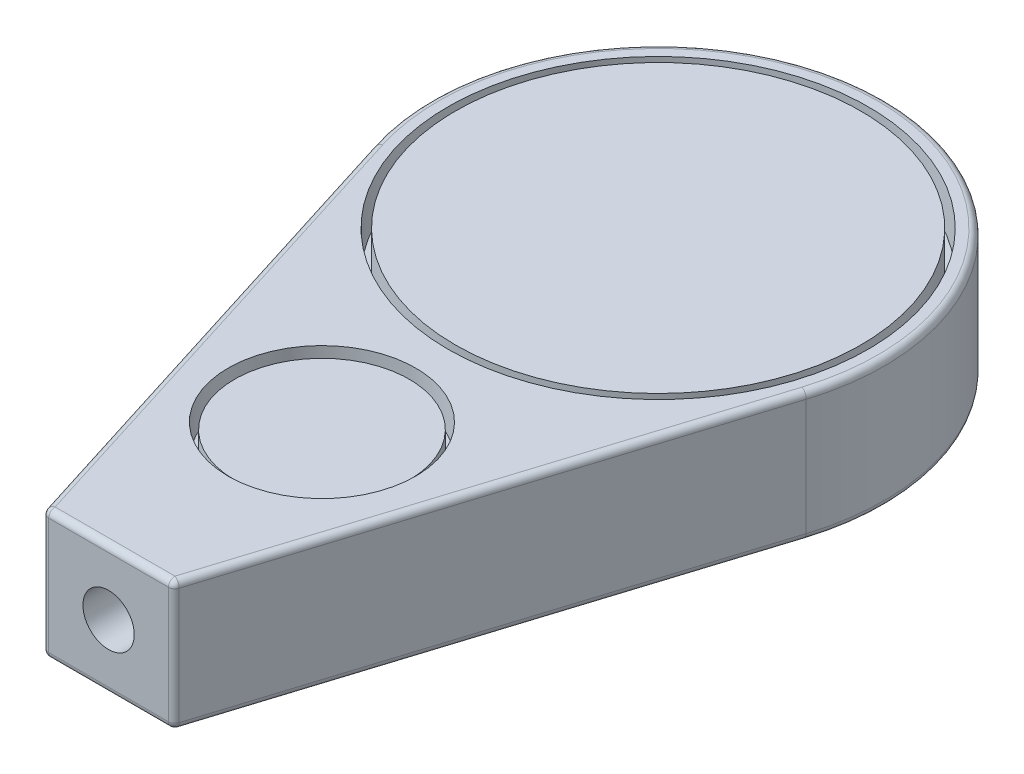
ISO-10303-21;
HEADER;
FILE_DESCRIPTION(('STEP AP214'),'2;1');
FILE_NAME('part.step','',(''),(''),'','','');
FILE_SCHEMA(('AUTOMOTIVE_DESIGN { 1 0 10303 214 1 1 1 1 }'));
ENDSEC;
DATA;
#1=APPLICATION_CONTEXT('core data for automotive mechanical design processes');
#2=APPLICATION_PROTOCOL_DEFINITION('international standard','automotive_design',2000,#1);
#3=PRODUCT_CONTEXT('',#1,'mechanical');
#4=PRODUCT('Part','Part','',(#3));
#5=PRODUCT_RELATED_PRODUCT_CATEGORY('part','',(#4));
#6=PRODUCT_DEFINITION_FORMATION('','',#4);
#7=PRODUCT_DEFINITION_CONTEXT('part definition',#1,'design');
#8=PRODUCT_DEFINITION('design','',#6,#7);
#9=PRODUCT_DEFINITION_SHAPE('','',#8);
#10=(LENGTH_UNIT() NAMED_UNIT(*) SI_UNIT(.MILLI.,.METRE.));
#11=(NAMED_UNIT(*) PLANE_ANGLE_UNIT() SI_UNIT($,.RADIAN.));
#12=(NAMED_UNIT(*) SI_UNIT($,.STERADIAN.) SOLID_ANGLE_UNIT());
#13=UNCERTAINTY_MEASURE_WITH_UNIT(LENGTH_MEASURE(1.E-05),#10,'distance_accuracy_value','');
#14=(GEOMETRIC_REPRESENTATION_CONTEXT(3) GLOBAL_UNCERTAINTY_ASSIGNED_CONTEXT((#13)) GLOBAL_UNIT_ASSIGNED_CONTEXT((#10,
#11,#12)) REPRESENTATION_CONTEXT('',''));
#15=CARTESIAN_POINT('',(0.,0.,0.));
#16=DIRECTION('',(0.,0.,1.));
#17=DIRECTION('',(1.,0.,0.));
#18=AXIS2_PLACEMENT_3D('',#15,#16,#17);
#19=CARTESIAN_POINT('',(0.,20.,0.));
#20=DIRECTION('',(0.,-1.,0.));
#21=DIRECTION('',(0.,0.,-1.));
#22=AXIS2_PLACEMENT_3D('',#19,#20,#21);
#23=CYLINDRICAL_SURFACE('',#22,35.);
#24=DIRECTION('',(0.,-1.,0.));
#25=VECTOR('',#24,1.);
#26=CARTESIAN_POINT('',(33.3931642127267,120.065845984876,10.4831571514439));
#27=LINE('',#26,#25);
#28=CARTESIAN_POINT('',(33.3931642127267,19.,10.4831571514439));
#29=VERTEX_POINT('',#28);
#30=CARTESIAN_POINT('',(33.3931642127267,1.,10.4831571514439));
#31=VERTEX_POINT('',#30);
#32=EDGE_CURVE('E150',#29,#31,#27,.T.);
#33=ORIENTED_EDGE('',*,*,#32,.T.);
#34=CARTESIAN_POINT('',(0.,1.,0.));
#35=DIRECTION('',(0.,1.,0.));
#36=DIRECTION('',(0.,0.,1.));
#37=AXIS2_PLACEMENT_3D('',#34,#35,#36);
#38=CIRCLE('',#37,35.);
#39=CARTESIAN_POINT('',(-33.3931642127267,1.,10.4831571514439));
#40=VERTEX_POINT('',#39);
#41=EDGE_CURVE('E187',#31,#40,#38,.T.);
#42=ORIENTED_EDGE('',*,*,#41,.T.);
#43=DIRECTION('',(0.,-1.,0.));
#44=VECTOR('',#43,1.);
#45=CARTESIAN_POINT('',(-33.3931642127267,120.065845984876,10.4831571514439));
#46=LINE('',#45,#44);
#47=CARTESIAN_POINT('',(-33.3931642127267,19.,10.4831571514439));
#48=VERTEX_POINT('',#47);
#49=EDGE_CURVE('E153',#48,#40,#46,.T.);
#50=ORIENTED_EDGE('',*,*,#49,.F.);
#51=CARTESIAN_POINT('',(0.,19.,0.));
#52=DIRECTION('',(0.,1.,0.));
#53=DIRECTION('',(0.,0.,1.));
#54=AXIS2_PLACEMENT_3D('',#51,#52,#53);
#55=CIRCLE('',#54,35.);
#56=EDGE_CURVE('E185',#48,#29,#55,.F.);
#57=ORIENTED_EDGE('',*,*,#56,.T.);
#58=EDGE_LOOP('',(#33,#42,#50,#57));
#59=FACE_BOUND('',#58,.T.);
#60=ADVANCED_FACE('F49',(#59),#23,.T.);
#61=CARTESIAN_POINT('',(0.,20.,0.));
#62=DIRECTION('',(0.,1.,0.));
#63=DIRECTION('',(0.,0.,1.));
#64=AXIS2_PLACEMENT_3D('',#61,#62,#63);
#65=PLANE('',#64);
#66=DIRECTION('',(1.,0.,0.));
#67=VECTOR('',#66,1.);
#68=CARTESIAN_POINT('',(10.,20.,84.));
#69=LINE('',#68,#67);
#70=CARTESIAN_POINT('',(-9.26581252700777,20.,84.));
#71=VERTEX_POINT('',#70);
#72=CARTESIAN_POINT('',(9.26581252700777,20.,84.));
#73=VERTEX_POINT('',#72);
#74=EDGE_CURVE('E191',#71,#73,#69,.T.);
#75=ORIENTED_EDGE('',*,*,#74,.T.);
#76=DIRECTION('',(0.299518775755541,0.,-0.954090406077905));
#77=VECTOR('',#76,1.);
#78=CARTESIAN_POINT('',(32.4390738066488,20.,10.1836383756884));
#79=LINE('',#78,#77);
#80=CARTESIAN_POINT('',(32.4390738066488,20.,10.1836383756884));
#81=VERTEX_POINT('',#80);
#82=EDGE_CURVE('E195',#73,#81,#79,.T.);
#83=ORIENTED_EDGE('',*,*,#82,.T.);
#84=CARTESIAN_POINT('',(0.,20.,0.));
#85=DIRECTION('',(0.,1.,0.));
#86=DIRECTION('',(0.,0.,1.));
#87=AXIS2_PLACEMENT_3D('',#84,#85,#86);
#88=CIRCLE('',#87,34.);
#89=CARTESIAN_POINT('',(-32.4390738066488,20.,10.1836383756884));
#90=VERTEX_POINT('',#89);
#91=EDGE_CURVE('E193',#81,#90,#88,.T.);
#92=ORIENTED_EDGE('',*,*,#91,.T.);
#93=DIRECTION('',(0.299518775755541,0.,0.954090406077905));
#94=VECTOR('',#93,1.);
#95=CARTESIAN_POINT('',(-9.04590959392208,20.,84.7004812242445));
#96=LINE('',#95,#94);
#97=EDGE_CURVE('E189',#90,#71,#96,.T.);
#98=ORIENTED_EDGE('',*,*,#97,.T.);
#99=EDGE_LOOP('',(#75,#83,#92,#98));
#100=FACE_BOUND('',#99,.T.);
#101=CARTESIAN_POINT('',(0.,20.,52.));
#102=DIRECTION('',(0.,1.,0.));
#103=DIRECTION('',(0.,0.,1.));
#104=AXIS2_PLACEMENT_3D('',#101,#102,#103);
#105=CIRCLE('',#104,14.5);
#106=CARTESIAN_POINT('',(0.,20.,66.5));
#107=VERTEX_POINT('',#106);
#108=EDGE_CURVE('E145',#107,#107,#105,.T.);
#109=ORIENTED_EDGE('',*,*,#108,.F.);
#110=EDGE_LOOP('',(#109));
#111=FACE_BOUND('',#110,.T.);
#112=CARTESIAN_POINT('',(0.,20.,0.));
#113=DIRECTION('',(0.,1.,0.));
#114=DIRECTION('',(0.,0.,1.));
#115=AXIS2_PLACEMENT_3D('',#112,#113,#114);
#116=CIRCLE('',#115,32.5);
#117=CARTESIAN_POINT('',(0.,20.,32.5));
#118=VERTEX_POINT('',#117);
#119=EDGE_CURVE('E163',#118,#118,#116,.T.);
#120=ORIENTED_EDGE('',*,*,#119,.F.);
#121=EDGE_LOOP('',(#120));
#122=FACE_BOUND('',#121,.T.);
#123=ADVANCED_FACE('F263',(#100,#111,#122),#65,.T.);
#124=CARTESIAN_POINT('',(0.,0.,0.));
#125=DIRECTION('',(0.,1.,0.));
#126=DIRECTION('',(0.,0.,1.));
#127=AXIS2_PLACEMENT_3D('',#124,#125,#126);
#128=PLANE('',#127);
#129=CARTESIAN_POINT('',(0.,0.,0.));
#130=DIRECTION('',(0.,1.,0.));
#131=DIRECTION('',(0.,0.,1.));
#132=AXIS2_PLACEMENT_3D('',#129,#130,#131);
#133=CIRCLE('',#132,34.);
#134=CARTESIAN_POINT('',(-32.4390738066488,0.,10.1836383756884));
#135=VERTEX_POINT('',#134);
#136=CARTESIAN_POINT('',(32.4390738066488,0.,10.1836383756884));
#137=VERTEX_POINT('',#136);
#138=EDGE_CURVE('E180',#135,#137,#133,.F.);
#139=ORIENTED_EDGE('',*,*,#138,.T.);
#140=DIRECTION('',(0.299518775755541,0.,-0.954090406077905));
#141=VECTOR('',#140,1.);
#142=CARTESIAN_POINT('',(32.4390738066488,0.,10.1836383756884));
#143=LINE('',#142,#141);
#144=CARTESIAN_POINT('',(9.26581252700778,0.,84.));
#145=VERTEX_POINT('',#144);
#146=EDGE_CURVE('E182',#137,#145,#143,.F.);
#147=ORIENTED_EDGE('',*,*,#146,.T.);
#148=DIRECTION('',(1.,0.,0.));
#149=VECTOR('',#148,1.);
#150=CARTESIAN_POINT('',(0.,0.,84.));
#151=LINE('',#150,#149);
#152=CARTESIAN_POINT('',(-9.26581252700777,0.,84.));
#153=VERTEX_POINT('',#152);
#154=EDGE_CURVE('E178',#145,#153,#151,.F.);
#155=ORIENTED_EDGE('',*,*,#154,.T.);
#156=DIRECTION('',(0.299518775755541,0.,0.954090406077905));
#157=VECTOR('',#156,1.);
#158=CARTESIAN_POINT('',(-32.4390738066488,0.,10.1836383756884));
#159=LINE('',#158,#157);
#160=EDGE_CURVE('E176',#153,#135,#159,.F.);
#161=ORIENTED_EDGE('',*,*,#160,.T.);
#162=EDGE_LOOP('',(#139,#147,#155,#161));
#163=FACE_BOUND('',#162,.T.);
#164=ADVANCED_FACE('F303',(#163),#128,.F.);
#165=CARTESIAN_POINT('',(0.,13.5,0.));
#166=DIRECTION('',(0.,1.,0.));
#167=DIRECTION('',(0.,0.,1.));
#168=AXIS2_PLACEMENT_3D('',#165,#166,#167);
#169=CYLINDRICAL_SURFACE('',#168,32.5);
#170=CARTESIAN_POINT('',(0.,13.5,0.));
#171=DIRECTION('',(0.,1.,0.));
#172=DIRECTION('',(0.,0.,1.));
#173=AXIS2_PLACEMENT_3D('',#170,#171,#172);
#174=CIRCLE('',#173,32.5);
#175=CARTESIAN_POINT('',(0.,13.5,32.5));
#176=VERTEX_POINT('',#175);
#177=EDGE_CURVE('E164',#176,#176,#174,.T.);
#178=CARTESIAN_POINT('',(0.,13.5,32.5));
#179=CARTESIAN_POINT('',(0.,13.5677083333333,32.5));
#180=CARTESIAN_POINT('',(0.,13.6354166666667,32.5));
#181=CARTESIAN_POINT('',(0.,13.7708333333333,32.5));
#182=CARTESIAN_POINT('',(0.,13.8385416666667,32.5));
#183=CARTESIAN_POINT('',(0.,13.9739583333333,32.5));
#184=CARTESIAN_POINT('',(0.,14.0416666666667,32.5));
#185=CARTESIAN_POINT('',(0.,14.1770833333333,32.5));
#186=CARTESIAN_POINT('',(0.,14.2447916666667,32.5));
#187=CARTESIAN_POINT('',(0.,14.3802083333333,32.5));
#188=CARTESIAN_POINT('',(0.,14.4479166666667,32.5));
#189=CARTESIAN_POINT('',(0.,14.5833333333333,32.5));
#190=CARTESIAN_POINT('',(0.,14.6510416666667,32.5));
#191=CARTESIAN_POINT('',(0.,14.7864583333333,32.5));
#192=CARTESIAN_POINT('',(0.,14.8541666666667,32.5));
#193=CARTESIAN_POINT('',(0.,14.9895833333333,32.5));
#194=CARTESIAN_POINT('',(0.,15.0572916666667,32.5));
#195=CARTESIAN_POINT('',(0.,15.1927083333333,32.5));
#196=CARTESIAN_POINT('',(0.,15.2604166666667,32.5));
#197=CARTESIAN_POINT('',(0.,15.3958333333333,32.5));
#198=CARTESIAN_POINT('',(0.,15.4635416666667,32.5));
#199=CARTESIAN_POINT('',(0.,15.5989583333333,32.5));
#200=CARTESIAN_POINT('',(0.,15.6666666666667,32.5));
#201=CARTESIAN_POINT('',(0.,15.8020833333333,32.5));
#202=CARTESIAN_POINT('',(0.,15.8697916666667,32.5));
#203=CARTESIAN_POINT('',(0.,16.0052083333333,32.5));
#204=CARTESIAN_POINT('',(0.,16.0729166666667,32.5));
#205=CARTESIAN_POINT('',(0.,16.2083333333333,32.5));
#206=CARTESIAN_POINT('',(0.,16.2760416666667,32.5));
#207=CARTESIAN_POINT('',(0.,16.4114583333333,32.5));
#208=CARTESIAN_POINT('',(0.,16.4791666666667,32.5));
#209=CARTESIAN_POINT('',(0.,16.6145833333333,32.5));
#210=CARTESIAN_POINT('',(0.,16.6822916666667,32.5));
#211=CARTESIAN_POINT('',(0.,16.8177083333333,32.5));
#212=CARTESIAN_POINT('',(0.,16.8854166666667,32.5));
#213=CARTESIAN_POINT('',(0.,17.0208333333333,32.5));
#214=CARTESIAN_POINT('',(0.,17.0885416666667,32.5));
#215=CARTESIAN_POINT('',(0.,17.2239583333333,32.5));
#216=CARTESIAN_POINT('',(0.,17.2916666666667,32.5));
#217=CARTESIAN_POINT('',(0.,17.4270833333333,32.5));
#218=CARTESIAN_POINT('',(0.,17.4947916666667,32.5));
#219=CARTESIAN_POINT('',(0.,17.6302083333333,32.5));
#220=CARTESIAN_POINT('',(0.,17.6979166666667,32.5));
#221=CARTESIAN_POINT('',(0.,17.8333333333333,32.5));
#222=CARTESIAN_POINT('',(0.,17.9010416666667,32.5));
#223=CARTESIAN_POINT('',(0.,18.0364583333333,32.5));
#224=CARTESIAN_POINT('',(0.,18.1041666666667,32.5));
#225=CARTESIAN_POINT('',(0.,18.2395833333333,32.5));
#226=CARTESIAN_POINT('',(0.,18.3072916666667,32.5));
#227=CARTESIAN_POINT('',(0.,18.4427083333333,32.5));
#228=CARTESIAN_POINT('',(0.,18.5104166666667,32.5));
#229=CARTESIAN_POINT('',(0.,18.6458333333333,32.5));
#230=CARTESIAN_POINT('',(0.,18.7135416666667,32.5));
#231=CARTESIAN_POINT('',(0.,18.8489583333333,32.5));
#232=CARTESIAN_POINT('',(0.,18.9166666666667,32.5));
#233=CARTESIAN_POINT('',(0.,19.0520833333333,32.5));
#234=CARTESIAN_POINT('',(0.,19.1197916666667,32.5));
#235=CARTESIAN_POINT('',(0.,19.2552083333333,32.5));
#236=CARTESIAN_POINT('',(0.,19.3229166666667,32.5));
#237=CARTESIAN_POINT('',(0.,19.4583333333333,32.5));
#238=CARTESIAN_POINT('',(0.,19.5260416666667,32.5));
#239=CARTESIAN_POINT('',(0.,19.6614583333333,32.5));
#240=CARTESIAN_POINT('',(0.,19.7291666666667,32.5));
#241=CARTESIAN_POINT('',(0.,19.8645833333333,32.5));
#242=CARTESIAN_POINT('',(0.,19.9322916666667,32.5));
#243=CARTESIAN_POINT('',(0.,20.,32.5));
#244=B_SPLINE_CURVE_WITH_KNOTS('',3,(#178,#179,#180,#181,#182,#183,#184,#185,#186,#187,#188,
#189,#190,#191,#192,#193,#194,#195,#196,#197,#198,#199,#200,#201,#202,#203,#204,#205,#206,#207,
#208,#209,#210,#211,#212,#213,#214,#215,#216,#217,#218,#219,#220,#221,#222,#223,#224,#225,#226,
#227,#228,#229,#230,#231,#232,#233,#234,#235,#236,#237,#238,#239,#240,#241,#242,#243),
.UNSPECIFIED.,.F.,.F.,(4,2,2,2,2,2,2,2,2,2,2,2,2,2,2,2,2,2,2,2,2,2,2,2,2,2,2,2,2,2,2,2,4),(0.,
0.203125,0.40625,0.609375000000001,0.812500000000001,1.015625,1.21875,1.421875,1.625,1.828125,
2.03125,2.234375,2.4375,2.640625,2.84375,3.046875,3.25,3.453125,3.65625,3.859375,4.0625,
4.265625,4.46875,4.671875,4.875,5.078125,5.28125,5.484375,5.6875,5.890625,6.09375,6.296875,6.5),.UNSPECIFIED.);
#245=EDGE_CURVE('BSEAM516',#176,#118,#244,.T.);
#246=ORIENTED_EDGE('',*,*,#177,.F.);
#247=ORIENTED_EDGE('',*,*,#119,.T.);
#248=ORIENTED_EDGE('',*,*,#245,.T.);
#249=ORIENTED_EDGE('',*,*,#245,.F.);
#250=EDGE_LOOP('',(#246,#248,#247,#249));
#251=FACE_BOUND('',#250,.T.);
#252=ADVANCED_FACE('F516',(#251),#169,.F.);
#253=CARTESIAN_POINT('',(0.,13.5,0.));
#254=DIRECTION('',(0.,1.,0.));
#255=DIRECTION('',(0.,0.,1.));
#256=AXIS2_PLACEMENT_3D('',#253,#254,#255);
#257=PLANE('',#256);
#258=CARTESIAN_POINT('',(0.,13.5,0.));
#259=DIRECTION('',(0.,1.,0.));
#260=DIRECTION('',(0.,0.,1.));
#261=AXIS2_PLACEMENT_3D('',#258,#259,#260);
#262=CIRCLE('',#261,31.35);
#263=CARTESIAN_POINT('',(0.,13.5,31.35));
#264=VERTEX_POINT('',#263);
#265=EDGE_CURVE('E155',#264,#264,#262,.T.);
#266=ORIENTED_EDGE('',*,*,#265,.F.);
#267=EDGE_LOOP('',(#266));
#268=FACE_BOUND('',#267,.T.);
#269=ORIENTED_EDGE('',*,*,#177,.T.);
#270=EDGE_LOOP('',(#269));
#271=FACE_BOUND('',#270,.T.);
#272=ADVANCED_FACE('F546',(#268,#271),#257,.T.);
#273=CARTESIAN_POINT('',(0.,108.671190360793,0.));
#274=DIRECTION('',(0.,-1.,0.));
#275=DIRECTION('',(0.,0.,-1.));
#276=AXIS2_PLACEMENT_3D('',#273,#274,#275);
#277=CYLINDRICAL_SURFACE('',#276,31.35);
#278=ORIENTED_EDGE('',*,*,#265,.T.);
#279=EDGE_LOOP('',(#278));
#280=FACE_BOUND('',#279,.T.);
#281=CARTESIAN_POINT('',(0.,20.,0.));
#282=DIRECTION('',(0.,1.,0.));
#283=DIRECTION('',(0.,0.,1.));
#284=AXIS2_PLACEMENT_3D('',#281,#282,#283);
#285=CIRCLE('',#284,31.35);
#286=CARTESIAN_POINT('',(0.,20.,31.35));
#287=VERTEX_POINT('',#286);
#288=EDGE_CURVE('E160',#287,#287,#285,.T.);
#289=ORIENTED_EDGE('',*,*,#288,.F.);
#290=EDGE_LOOP('',(#289));
#291=FACE_BOUND('',#290,.T.);
#292=ADVANCED_FACE('F537',(#280,#291),#277,.T.);
#293=CARTESIAN_POINT('',(0.,20.,0.));
#294=DIRECTION('',(0.,1.,0.));
#295=DIRECTION('',(0.,0.,1.));
#296=AXIS2_PLACEMENT_3D('',#293,#294,#295);
#297=PLANE('',#296);
#298=ORIENTED_EDGE('',*,*,#288,.T.);
#299=EDGE_LOOP('',(#298));
#300=FACE_BOUND('',#299,.T.);
#301=ADVANCED_FACE('F507',(#300),#297,.T.);
#302=CARTESIAN_POINT('',(-33.3931642127267,120.065845984876,10.4831571514439));
#303=DIRECTION('',(0.954090406077905,0.,-0.299518775755541));
#304=DIRECTION('',(-0.299518775755541,0.,-0.954090406077905));
#305=AXIS2_PLACEMENT_3D('',#302,#303,#304);
#306=PLANE('',#305);
#307=ORIENTED_EDGE('',*,*,#49,.T.);
#308=DIRECTION('',(0.299518775755541,0.,0.954090406077905));
#309=VECTOR('',#308,1.);
#310=CARTESIAN_POINT('',(-33.3931642127267,1.,10.4831571514439));
#311=LINE('',#310,#309);
#312=CARTESIAN_POINT('',(-10.2199029330857,1.,84.2995187757555));
#313=VERTEX_POINT('',#312);
#314=EDGE_CURVE('E13',#40,#313,#311,.T.);
#315=ORIENTED_EDGE('',*,*,#314,.T.);
#316=DIRECTION('',(0.,-1.,0.));
#317=VECTOR('',#316,1.);
#318=CARTESIAN_POINT('',(-10.2199029330857,120.065845984876,84.2995187757556));
#319=LINE('',#318,#317);
#320=CARTESIAN_POINT('',(-10.2199029330857,19.,84.2995187757555));
#321=VERTEX_POINT('',#320);
#322=EDGE_CURVE('E58',#313,#321,#319,.F.);
#323=ORIENTED_EDGE('',*,*,#322,.T.);
#324=DIRECTION('',(0.299518775755541,0.,0.954090406077905));
#325=VECTOR('',#324,1.);
#326=CARTESIAN_POINT('',(-33.3931642127267,19.,10.4831571514439));
#327=LINE('',#326,#325);
#328=EDGE_CURVE('E207',#321,#48,#327,.F.);
#329=ORIENTED_EDGE('',*,*,#328,.T.);
#330=EDGE_LOOP('',(#307,#315,#323,#329));
#331=FACE_BOUND('',#330,.T.);
#332=ADVANCED_FACE('F291',(#331),#306,.F.);
#333=CARTESIAN_POINT('',(0.,120.065845984876,85.));
#334=DIRECTION('',(0.,0.,-1.));
#335=DIRECTION('',(-1.,0.,0.));
#336=AXIS2_PLACEMENT_3D('',#333,#334,#335);
#337=PLANE('',#336);
#338=DIRECTION('',(1.,0.,0.));
#339=VECTOR('',#338,1.);
#340=CARTESIAN_POINT('',(0.,1.,85.));
#341=LINE('',#340,#339);
#342=CARTESIAN_POINT('',(-9.26581252700778,1.,85.));
#343=VERTEX_POINT('',#342);
#344=CARTESIAN_POINT('',(9.26581252700778,1.,85.));
#345=VERTEX_POINT('',#344);
#346=EDGE_CURVE('E202',#343,#345,#341,.T.);
#347=ORIENTED_EDGE('',*,*,#346,.T.);
#348=DIRECTION('',(0.,-1.,0.));
#349=VECTOR('',#348,1.);
#350=CARTESIAN_POINT('',(9.26581252700778,120.065845984876,85.));
#351=LINE('',#350,#349);
#352=CARTESIAN_POINT('',(9.26581252700778,19.,85.));
#353=VERTEX_POINT('',#352);
#354=EDGE_CURVE('E204',#345,#353,#351,.F.);
#355=ORIENTED_EDGE('',*,*,#354,.T.);
#356=DIRECTION('',(1.,0.,0.));
#357=VECTOR('',#356,1.);
#358=CARTESIAN_POINT('',(-9.99999999999999,19.,85.));
#359=LINE('',#358,#357);
#360=CARTESIAN_POINT('',(-9.26581252700778,19.,85.));
#361=VERTEX_POINT('',#360);
#362=EDGE_CURVE('E198',#353,#361,#359,.F.);
#363=ORIENTED_EDGE('',*,*,#362,.T.);
#364=DIRECTION('',(0.,-1.,0.));
#365=VECTOR('',#364,1.);
#366=CARTESIAN_POINT('',(-9.26581252700778,120.065845984876,85.));
#367=LINE('',#366,#365);
#368=EDGE_CURVE('E200',#361,#343,#367,.T.);
#369=ORIENTED_EDGE('',*,*,#368,.T.);
#370=EDGE_LOOP('',(#347,#355,#363,#369));
#371=FACE_BOUND('',#370,.T.);
#372=CARTESIAN_POINT('',(0.,10.,85.));
#373=DIRECTION('',(0.,0.,1.));
#374=DIRECTION('',(1.,0.,0.));
#375=AXIS2_PLACEMENT_3D('',#372,#373,#374);
#376=CIRCLE('',#375,3.96874999999999);
#377=CARTESIAN_POINT('',(3.96874999999999,10.,85.));
#378=VERTEX_POINT('',#377);
#379=EDGE_CURVE('E136',#378,#378,#376,.T.);
#380=ORIENTED_EDGE('',*,*,#379,.F.);
#381=EDGE_LOOP('',(#380));
#382=FACE_BOUND('',#381,.T.);
#383=ADVANCED_FACE('F491',(#371,#382),#337,.F.);
#384=CARTESIAN_POINT('',(33.3931642127267,120.065845984876,10.4831571514439));
#385=DIRECTION('',(-0.954090406077905,0.,-0.299518775755541));
#386=DIRECTION('',(-0.299518775755541,0.,0.954090406077905));
#387=AXIS2_PLACEMENT_3D('',#384,#385,#386);
#388=PLANE('',#387);
#389=DIRECTION('',(0.,-1.,0.));
#390=VECTOR('',#389,1.);
#391=CARTESIAN_POINT('',(10.2199029330857,120.065845984876,84.2995187757556));
#392=LINE('',#391,#390);
#393=CARTESIAN_POINT('',(10.2199029330857,19.,84.2995187757555));
#394=VERTEX_POINT('',#393);
#395=CARTESIAN_POINT('',(10.2199029330857,1.,84.2995187757555));
#396=VERTEX_POINT('',#395);
#397=EDGE_CURVE('E167',#394,#396,#392,.T.);
#398=ORIENTED_EDGE('',*,*,#397,.T.);
#399=DIRECTION('',(0.299518775755541,0.,-0.954090406077905));
#400=VECTOR('',#399,1.);
#401=CARTESIAN_POINT('',(33.3931642127267,1.,10.4831571514439));
#402=LINE('',#401,#400);
#403=EDGE_CURVE('E173',#396,#31,#402,.T.);
#404=ORIENTED_EDGE('',*,*,#403,.T.);
#405=ORIENTED_EDGE('',*,*,#32,.F.);
#406=DIRECTION('',(0.299518775755541,0.,-0.954090406077905));
#407=VECTOR('',#406,1.);
#408=CARTESIAN_POINT('',(9.99999999999999,19.,85.));
#409=LINE('',#408,#407);
#410=EDGE_CURVE('E171',#29,#394,#409,.F.);
#411=ORIENTED_EDGE('',*,*,#410,.T.);
#412=EDGE_LOOP('',(#398,#404,#405,#411));
#413=FACE_BOUND('',#412,.T.);
#414=ADVANCED_FACE('F285',(#413),#388,.F.);
#415=CARTESIAN_POINT('',(0.,15.,52.));
#416=DIRECTION('',(0.,1.,0.));
#417=DIRECTION('',(0.,0.,1.));
#418=AXIS2_PLACEMENT_3D('',#415,#416,#417);
#419=CYLINDRICAL_SURFACE('',#418,14.5);
#420=CARTESIAN_POINT('',(0.,15.,52.));
#421=DIRECTION('',(0.,1.,0.));
#422=DIRECTION('',(0.,0.,1.));
#423=AXIS2_PLACEMENT_3D('',#420,#421,#422);
#424=CIRCLE('',#423,14.5);
#425=CARTESIAN_POINT('',(0.,15.,66.5));
#426=VERTEX_POINT('',#425);
#427=EDGE_CURVE('E147',#426,#426,#424,.T.);
#428=ORIENTED_EDGE('',*,*,#427,.F.);
#429=EDGE_LOOP('',(#428));
#430=FACE_BOUND('',#429,.T.);
#431=ORIENTED_EDGE('',*,*,#108,.T.);
#432=EDGE_LOOP('',(#431));
#433=FACE_BOUND('',#432,.T.);
#434=ADVANCED_FACE('F474',(#430,#433),#419,.F.);
#435=CARTESIAN_POINT('',(0.,15.,52.));
#436=DIRECTION('',(0.,1.,0.));
#437=DIRECTION('',(0.,0.,1.));
#438=AXIS2_PLACEMENT_3D('',#435,#436,#437);
#439=PLANE('',#438);
#440=CARTESIAN_POINT('',(0.,15.,52.));
#441=DIRECTION('',(0.,1.,0.));
#442=DIRECTION('',(0.,0.,1.));
#443=AXIS2_PLACEMENT_3D('',#440,#441,#442);
#444=CIRCLE('',#443,13.5);
#445=CARTESIAN_POINT('',(0.,15.,65.5));
#446=VERTEX_POINT('',#445);
#447=EDGE_CURVE('E135',#446,#446,#444,.T.);
#448=ORIENTED_EDGE('',*,*,#447,.F.);
#449=EDGE_LOOP('',(#448));
#450=FACE_BOUND('',#449,.T.);
#451=ORIENTED_EDGE('',*,*,#427,.T.);
#452=EDGE_LOOP('',(#451));
#453=FACE_BOUND('',#452,.T.);
#454=ADVANCED_FACE('F465',(#450,#453),#439,.T.);
#455=CARTESIAN_POINT('',(0.,19.,52.));
#456=DIRECTION('',(0.,-1.,0.));
#457=DIRECTION('',(0.,0.,-1.));
#458=AXIS2_PLACEMENT_3D('',#455,#456,#457);
#459=CYLINDRICAL_SURFACE('',#458,13.5);
#460=CARTESIAN_POINT('',(0.,19.,52.));
#461=DIRECTION('',(0.,1.,0.));
#462=DIRECTION('',(0.,0.,1.));
#463=AXIS2_PLACEMENT_3D('',#460,#461,#462);
#464=CIRCLE('',#463,13.5);
#465=CARTESIAN_POINT('',(0.,19.,65.5));
#466=VERTEX_POINT('',#465);
#467=EDGE_CURVE('E139',#466,#466,#464,.T.);
#468=ORIENTED_EDGE('',*,*,#467,.F.);
#469=EDGE_LOOP('',(#468));
#470=FACE_BOUND('',#469,.T.);
#471=ORIENTED_EDGE('',*,*,#447,.T.);
#472=EDGE_LOOP('',(#471));
#473=FACE_BOUND('',#472,.T.);
#474=ADVANCED_FACE('F456',(#470,#473),#459,.T.);
#475=CARTESIAN_POINT('',(0.,19.,52.));
#476=DIRECTION('',(0.,1.,0.));
#477=DIRECTION('',(0.,0.,1.));
#478=AXIS2_PLACEMENT_3D('',#475,#476,#477);
#479=PLANE('',#478);
#480=ORIENTED_EDGE('',*,*,#467,.T.);
#481=EDGE_LOOP('',(#480));
#482=FACE_BOUND('',#481,.T.);
#483=ADVANCED_FACE('F129',(#482),#479,.T.);
#484=CARTESIAN_POINT('',(0.,10.,45.));
#485=DIRECTION('',(0.,0.,1.));
#486=DIRECTION('',(1.,0.,0.));
#487=AXIS2_PLACEMENT_3D('',#484,#485,#486);
#488=CONICAL_SURFACE('',#487,3.96874999999999,1.02974425867665);
#489=CARTESIAN_POINT('',(0.,10.,42.6153344182344));
#490=VERTEX_POINT('',#489);
#491=VERTEX_LOOP('',#490);
#492=FACE_BOUND('',#491,.T.);
#493=CARTESIAN_POINT('',(0.,10.,45.));
#494=DIRECTION('',(0.,0.,1.));
#495=DIRECTION('',(1.,0.,0.));
#496=AXIS2_PLACEMENT_3D('',#493,#494,#495);
#497=CIRCLE('',#496,3.96874999999999);
#498=CARTESIAN_POINT('',(3.96874999999999,10.,45.));
#499=VERTEX_POINT('',#498);
#500=EDGE_CURVE('E133',#499,#499,#497,.T.);
#501=ORIENTED_EDGE('',*,*,#500,.T.);
#502=EDGE_LOOP('',(#501));
#503=FACE_BOUND('',#502,.T.);
#504=ADVANCED_FACE('F125',(#492,#503),#488,.F.);
#505=CARTESIAN_POINT('',(0.,10.,85.));
#506=DIRECTION('',(0.,0.,1.));
#507=DIRECTION('',(1.,0.,0.));
#508=AXIS2_PLACEMENT_3D('',#505,#506,#507);
#509=CYLINDRICAL_SURFACE('',#508,3.96874999999999);
#510=ORIENTED_EDGE('',*,*,#500,.F.);
#511=EDGE_LOOP('',(#510));
#512=FACE_BOUND('',#511,.T.);
#513=ORIENTED_EDGE('',*,*,#379,.T.);
#514=EDGE_LOOP('',(#513));
#515=FACE_BOUND('',#514,.T.);
#516=ADVANCED_FACE('F128',(#512,#515),#509,.F.);
#517=CARTESIAN_POINT('',(-32.4390738066488,19.,10.1836383756884));
#518=DIRECTION('',(-0.299518775755541,0.,-0.954090406077905));
#519=DIRECTION('',(-0.954090406077905,0.,0.299518775755541));
#520=AXIS2_PLACEMENT_3D('',#517,#518,#519);
#521=CYLINDRICAL_SURFACE('',#520,1.);
#522=CARTESIAN_POINT('',(-9.26581252700777,19.,84.));
#523=DIRECTION('',(0.29951877575554,0.,0.954090406077905));
#524=DIRECTION('',(0.954090406077906,0.,-0.29951877575554));
#525=AXIS2_PLACEMENT_3D('',#522,#523,#524);
#526=CIRCLE('',#525,1.);
#527=EDGE_CURVE('E247',#71,#321,#526,.T.);
#528=ORIENTED_EDGE('',*,*,#527,.F.);
#529=ORIENTED_EDGE('',*,*,#97,.F.);
#530=CARTESIAN_POINT('',(-32.4390738066488,19.,10.1836383756884));
#531=DIRECTION('',(-0.29951877575554,0.,-0.954090406077905));
#532=DIRECTION('',(-0.954090406077906,0.,0.29951877575554));
#533=AXIS2_PLACEMENT_3D('',#530,#531,#532);
#534=CIRCLE('',#533,1.);
#535=EDGE_CURVE('E53',#48,#90,#534,.T.);
#536=ORIENTED_EDGE('',*,*,#535,.F.);
#537=ORIENTED_EDGE('',*,*,#328,.F.);
#538=EDGE_LOOP('',(#528,#529,#536,#537));
#539=FACE_BOUND('',#538,.T.);
#540=ADVANCED_FACE('F51',(#539),#521,.T.);
#541=CARTESIAN_POINT('',(0.,19.,0.));
#542=DIRECTION('',(0.,1.,0.));
#543=DIRECTION('',(0.,0.,1.));
#544=AXIS2_PLACEMENT_3D('',#541,#542,#543);
#545=TOROIDAL_SURFACE('',#544,34.,1.);
#546=ORIENTED_EDGE('',*,*,#535,.T.);
#547=ORIENTED_EDGE('',*,*,#91,.F.);
#548=CARTESIAN_POINT('',(32.4390738066488,19.,10.1836383756884));
#549=DIRECTION('',(-0.29951877575554,0.,0.954090406077905));
#550=DIRECTION('',(0.954090406077906,0.,0.29951877575554));
#551=AXIS2_PLACEMENT_3D('',#548,#549,#550);
#552=CIRCLE('',#551,1.);
#553=EDGE_CURVE('E243',#29,#81,#552,.T.);
#554=ORIENTED_EDGE('',*,*,#553,.F.);
#555=ORIENTED_EDGE('',*,*,#56,.F.);
#556=EDGE_LOOP('',(#546,#547,#554,#555));
#557=FACE_BOUND('',#556,.T.);
#558=ADVANCED_FACE('F258',(#557),#545,.T.);
#559=CARTESIAN_POINT('',(-9.26581252700778,19.,84.));
#560=DIRECTION('',(0.,0.,1.));
#561=DIRECTION('',(1.,0.,0.));
#562=AXIS2_PLACEMENT_3D('',#559,#560,#561);
#563=SPHERICAL_SURFACE('',#562,1.);
#564=CARTESIAN_POINT('',(-9.26581252700778,19.,84.));
#565=DIRECTION('',(0.,1.,0.));
#566=DIRECTION('',(0.,0.,1.));
#567=AXIS2_PLACEMENT_3D('',#564,#565,#566);
#568=CIRCLE('',#567,1.);
#569=EDGE_CURVE('E240',#361,#321,#568,.F.);
#570=ORIENTED_EDGE('',*,*,#569,.F.);
#571=CARTESIAN_POINT('',(-9.26581252700778,19.,84.));
#572=DIRECTION('',(-1.,0.,0.));
#573=DIRECTION('',(0.,-1.,0.));
#574=AXIS2_PLACEMENT_3D('',#571,#572,#573);
#575=CIRCLE('',#574,1.);
#576=EDGE_CURVE('E245',#71,#361,#575,.F.);
#577=ORIENTED_EDGE('',*,*,#576,.F.);
#578=ORIENTED_EDGE('',*,*,#527,.T.);
#579=EDGE_LOOP('',(#570,#577,#578));
#580=FACE_BOUND('',#579,.T.);
#581=ADVANCED_FACE('F320',(#580),#563,.T.);
#582=CARTESIAN_POINT('',(0.,19.,84.));
#583=DIRECTION('',(-1.,0.,0.));
#584=DIRECTION('',(0.,0.,1.));
#585=AXIS2_PLACEMENT_3D('',#582,#583,#584);
#586=CYLINDRICAL_SURFACE('',#585,1.);
#587=ORIENTED_EDGE('',*,*,#576,.T.);
#588=ORIENTED_EDGE('',*,*,#362,.F.);
#589=CARTESIAN_POINT('',(9.26581252700777,19.,84.));
#590=DIRECTION('',(1.,0.,0.));
#591=DIRECTION('',(0.,0.,-1.));
#592=AXIS2_PLACEMENT_3D('',#589,#590,#591);
#593=CIRCLE('',#592,1.);
#594=EDGE_CURVE('E237',#73,#353,#593,.T.);
#595=ORIENTED_EDGE('',*,*,#594,.F.);
#596=ORIENTED_EDGE('',*,*,#74,.F.);
#597=EDGE_LOOP('',(#587,#588,#595,#596));
#598=FACE_BOUND('',#597,.T.);
#599=ADVANCED_FACE('F275',(#598),#586,.T.);
#600=CARTESIAN_POINT('',(32.4390738066488,19.,10.1836383756884));
#601=DIRECTION('',(-0.299518775755541,0.,0.954090406077905));
#602=DIRECTION('',(0.954090406077905,0.,0.299518775755541));
#603=AXIS2_PLACEMENT_3D('',#600,#601,#602);
#604=CYLINDRICAL_SURFACE('',#603,1.);
#605=ORIENTED_EDGE('',*,*,#553,.T.);
#606=ORIENTED_EDGE('',*,*,#82,.F.);
#607=CARTESIAN_POINT('',(9.26581252700777,19.,84.));
#608=DIRECTION('',(-0.299518775755542,0.,0.954090406077905));
#609=DIRECTION('',(0.954090406077905,0.,0.299518775755542));
#610=AXIS2_PLACEMENT_3D('',#607,#608,#609);
#611=CIRCLE('',#610,1.);
#612=EDGE_CURVE('E234',#394,#73,#611,.T.);
#613=ORIENTED_EDGE('',*,*,#612,.F.);
#614=ORIENTED_EDGE('',*,*,#410,.F.);
#615=EDGE_LOOP('',(#605,#606,#613,#614));
#616=FACE_BOUND('',#615,.T.);
#617=ADVANCED_FACE('F270',(#616),#604,.T.);
#618=CARTESIAN_POINT('',(-9.26581252700778,120.065845984876,84.));
#619=DIRECTION('',(0.,-1.,0.));
#620=DIRECTION('',(0.,0.,-1.));
#621=AXIS2_PLACEMENT_3D('',#618,#619,#620);
#622=CYLINDRICAL_SURFACE('',#621,1.);
#623=ORIENTED_EDGE('',*,*,#569,.T.);
#624=ORIENTED_EDGE('',*,*,#322,.F.);
#625=CARTESIAN_POINT('',(-9.26581252700778,1.,84.));
#626=DIRECTION('',(0.,-1.,0.));
#627=DIRECTION('',(0.,0.,-1.));
#628=AXIS2_PLACEMENT_3D('',#625,#626,#627);
#629=CIRCLE('',#628,1.);
#630=EDGE_CURVE('E231',#343,#313,#629,.T.);
#631=ORIENTED_EDGE('',*,*,#630,.F.);
#632=ORIENTED_EDGE('',*,*,#368,.F.);
#633=EDGE_LOOP('',(#623,#624,#631,#632));
#634=FACE_BOUND('',#633,.T.);
#635=ADVANCED_FACE('F319',(#634),#622,.T.);
#636=CARTESIAN_POINT('',(9.26581252700778,19.,84.));
#637=DIRECTION('',(0.,0.,1.));
#638=DIRECTION('',(1.,0.,0.));
#639=AXIS2_PLACEMENT_3D('',#636,#637,#638);
#640=SPHERICAL_SURFACE('',#639,1.);
#641=ORIENTED_EDGE('',*,*,#612,.T.);
#642=ORIENTED_EDGE('',*,*,#594,.T.);
#643=CARTESIAN_POINT('',(9.26581252700778,19.,84.));
#644=DIRECTION('',(0.,1.,0.));
#645=DIRECTION('',(0.,0.,1.));
#646=AXIS2_PLACEMENT_3D('',#643,#644,#645);
#647=CIRCLE('',#646,1.);
#648=EDGE_CURVE('E226',#394,#353,#647,.F.);
#649=ORIENTED_EDGE('',*,*,#648,.F.);
#650=EDGE_LOOP('',(#641,#642,#649));
#651=FACE_BOUND('',#650,.T.);
#652=ADVANCED_FACE('F277',(#651),#640,.T.);
#653=CARTESIAN_POINT('',(-9.26581252700778,1.,84.));
#654=DIRECTION('',(0.,0.,1.));
#655=DIRECTION('',(1.,0.,0.));
#656=AXIS2_PLACEMENT_3D('',#653,#654,#655);
#657=SPHERICAL_SURFACE('',#656,1.);
#658=CARTESIAN_POINT('',(-9.26581252700778,1.,84.));
#659=DIRECTION('',(0.299518775755542,0.,0.954090406077905));
#660=DIRECTION('',(0.954090406077905,0.,-0.299518775755542));
#661=AXIS2_PLACEMENT_3D('',#658,#659,#660);
#662=CIRCLE('',#661,1.);
#663=EDGE_CURVE('E223',#153,#313,#662,.F.);
#664=ORIENTED_EDGE('',*,*,#663,.F.);
#665=CARTESIAN_POINT('',(-9.26581252700777,1.,84.));
#666=DIRECTION('',(-1.,0.,0.));
#667=DIRECTION('',(0.,0.,1.));
#668=AXIS2_PLACEMENT_3D('',#665,#666,#667);
#669=CIRCLE('',#668,1.);
#670=EDGE_CURVE('E228',#343,#153,#669,.F.);
#671=ORIENTED_EDGE('',*,*,#670,.F.);
#672=ORIENTED_EDGE('',*,*,#630,.T.);
#673=EDGE_LOOP('',(#664,#671,#672));
#674=FACE_BOUND('',#673,.T.);
#675=ADVANCED_FACE('F315',(#674),#657,.T.);
#676=CARTESIAN_POINT('',(0.,1.,84.));
#677=DIRECTION('',(1.,0.,0.));
#678=DIRECTION('',(0.,0.,-1.));
#679=AXIS2_PLACEMENT_3D('',#676,#677,#678);
#680=CYLINDRICAL_SURFACE('',#679,1.);
#681=ORIENTED_EDGE('',*,*,#670,.T.);
#682=ORIENTED_EDGE('',*,*,#154,.F.);
#683=CARTESIAN_POINT('',(9.26581252700778,1.,84.));
#684=DIRECTION('',(1.,0.,0.));
#685=DIRECTION('',(0.,1.,0.));
#686=AXIS2_PLACEMENT_3D('',#683,#684,#685);
#687=CIRCLE('',#686,1.);
#688=EDGE_CURVE('E220',#345,#145,#687,.T.);
#689=ORIENTED_EDGE('',*,*,#688,.F.);
#690=ORIENTED_EDGE('',*,*,#346,.F.);
#691=EDGE_LOOP('',(#681,#682,#689,#690));
#692=FACE_BOUND('',#691,.T.);
#693=ADVANCED_FACE('F312',(#692),#680,.T.);
#694=CARTESIAN_POINT('',(9.26581252700778,120.065845984876,84.));
#695=DIRECTION('',(0.,-1.,0.));
#696=DIRECTION('',(0.,0.,-1.));
#697=AXIS2_PLACEMENT_3D('',#694,#695,#696);
#698=CYLINDRICAL_SURFACE('',#697,1.);
#699=ORIENTED_EDGE('',*,*,#648,.T.);
#700=ORIENTED_EDGE('',*,*,#354,.F.);
#701=CARTESIAN_POINT('',(9.26581252700777,1.,84.));
#702=DIRECTION('',(0.,-1.,0.));
#703=DIRECTION('',(0.,0.,-1.));
#704=AXIS2_PLACEMENT_3D('',#701,#702,#703);
#705=CIRCLE('',#704,1.);
#706=EDGE_CURVE('E217',#396,#345,#705,.T.);
#707=ORIENTED_EDGE('',*,*,#706,.F.);
#708=ORIENTED_EDGE('',*,*,#397,.F.);
#709=EDGE_LOOP('',(#699,#700,#707,#708));
#710=FACE_BOUND('',#709,.T.);
#711=ADVANCED_FACE('F282',(#710),#698,.T.);
#712=CARTESIAN_POINT('',(-32.4390738066488,1.,10.1836383756884));
#713=DIRECTION('',(0.299518775755541,0.,0.954090406077905));
#714=DIRECTION('',(0.954090406077905,0.,-0.299518775755541));
#715=AXIS2_PLACEMENT_3D('',#712,#713,#714);
#716=CYLINDRICAL_SURFACE('',#715,1.);
#717=ORIENTED_EDGE('',*,*,#663,.T.);
#718=ORIENTED_EDGE('',*,*,#314,.F.);
#719=CARTESIAN_POINT('',(-32.4390738066488,1.,10.1836383756884));
#720=DIRECTION('',(-0.29951877575554,0.,-0.954090406077905));
#721=DIRECTION('',(-0.954090406077906,0.,0.29951877575554));
#722=AXIS2_PLACEMENT_3D('',#719,#720,#721);
#723=CIRCLE('',#722,1.);
#724=EDGE_CURVE('E214',#135,#40,#723,.T.);
#725=ORIENTED_EDGE('',*,*,#724,.F.);
#726=ORIENTED_EDGE('',*,*,#160,.F.);
#727=EDGE_LOOP('',(#717,#718,#725,#726));
#728=FACE_BOUND('',#727,.T.);
#729=ADVANCED_FACE('F294',(#728),#716,.T.);
#730=CARTESIAN_POINT('',(9.26581252700778,1.,84.));
#731=DIRECTION('',(0.,0.,1.));
#732=DIRECTION('',(1.,0.,0.));
#733=AXIS2_PLACEMENT_3D('',#730,#731,#732);
#734=SPHERICAL_SURFACE('',#733,1.);
#735=ORIENTED_EDGE('',*,*,#706,.T.);
#736=ORIENTED_EDGE('',*,*,#688,.T.);
#737=CARTESIAN_POINT('',(9.26581252700778,1.,84.));
#738=DIRECTION('',(-0.299518775755543,0.,0.954090406077904));
#739=DIRECTION('',(0.954090406077905,0.,0.299518775755543));
#740=AXIS2_PLACEMENT_3D('',#737,#738,#739);
#741=CIRCLE('',#740,1.);
#742=EDGE_CURVE('E212',#396,#145,#741,.F.);
#743=ORIENTED_EDGE('',*,*,#742,.F.);
#744=EDGE_LOOP('',(#735,#736,#743));
#745=FACE_BOUND('',#744,.T.);
#746=ADVANCED_FACE('F309',(#745),#734,.T.);
#747=CARTESIAN_POINT('',(0.,1.,0.));
#748=DIRECTION('',(0.,1.,0.));
#749=DIRECTION('',(0.,0.,1.));
#750=AXIS2_PLACEMENT_3D('',#747,#748,#749);
#751=TOROIDAL_SURFACE('',#750,34.,1.);
#752=ORIENTED_EDGE('',*,*,#724,.T.);
#753=ORIENTED_EDGE('',*,*,#41,.F.);
#754=CARTESIAN_POINT('',(32.4390738066488,1.,10.1836383756884));
#755=DIRECTION('',(-0.299518775755538,0.,0.954090406077906));
#756=DIRECTION('',(0.954090406077906,0.,0.299518775755538));
#757=AXIS2_PLACEMENT_3D('',#754,#755,#756);
#758=CIRCLE('',#757,1.);
#759=EDGE_CURVE('E210',#137,#31,#758,.T.);
#760=ORIENTED_EDGE('',*,*,#759,.F.);
#761=ORIENTED_EDGE('',*,*,#138,.F.);
#762=EDGE_LOOP('',(#752,#753,#760,#761));
#763=FACE_BOUND('',#762,.T.);
#764=ADVANCED_FACE('F299',(#763),#751,.T.);
#765=CARTESIAN_POINT('',(32.4390738066488,1.,10.1836383756884));
#766=DIRECTION('',(0.299518775755541,0.,-0.954090406077905));
#767=DIRECTION('',(-0.954090406077905,0.,-0.299518775755541));
#768=AXIS2_PLACEMENT_3D('',#765,#766,#767);
#769=CYLINDRICAL_SURFACE('',#768,1.);
#770=ORIENTED_EDGE('',*,*,#742,.T.);
#771=ORIENTED_EDGE('',*,*,#146,.F.);
#772=ORIENTED_EDGE('',*,*,#759,.T.);
#773=ORIENTED_EDGE('',*,*,#403,.F.);
#774=EDGE_LOOP('',(#770,#771,#772,#773));
#775=FACE_BOUND('',#774,.T.);
#776=ADVANCED_FACE('F305',(#775),#769,.T.);
#777=CLOSED_SHELL('',(#60,#123,#164,#252,#272,#292,#301,#332,#383,#414,#434,#454,#474,#483,#504,
#516,#540,#558,#581,#599,#617,#635,#652,#675,#693,#711,#729,#746,#764,#776));
#778=MANIFOLD_SOLID_BREP('B2',#777);
#779=ADVANCED_BREP_SHAPE_REPRESENTATION('',(#18,#778),#14);
#780=SHAPE_DEFINITION_REPRESENTATION(#9,#779);
ENDSEC;
END-ISO-10303-21;
